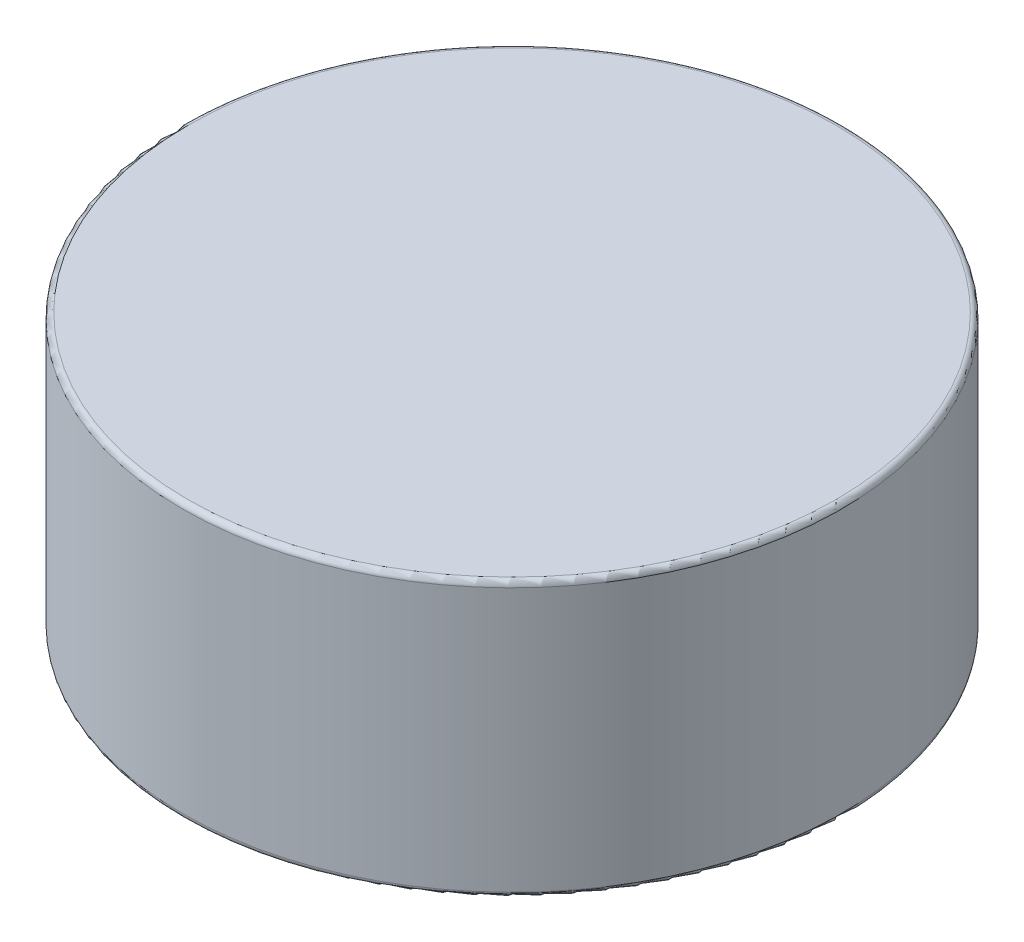
ISO-10303-21;
HEADER;
FILE_DESCRIPTION(('STEP AP214'),'2;1');
FILE_NAME('part.step','',(''),(''),'','','');
FILE_SCHEMA(('AUTOMOTIVE_DESIGN { 1 0 10303 214 1 1 1 1 }'));
ENDSEC;
DATA;
#1=APPLICATION_CONTEXT('core data for automotive mechanical design processes');
#2=APPLICATION_PROTOCOL_DEFINITION('international standard','automotive_design',2000,#1);
#3=PRODUCT_CONTEXT('',#1,'mechanical');
#4=PRODUCT('Part','Part','',(#3));
#5=PRODUCT_RELATED_PRODUCT_CATEGORY('part','',(#4));
#6=PRODUCT_DEFINITION_FORMATION('','',#4);
#7=PRODUCT_DEFINITION_CONTEXT('part definition',#1,'design');
#8=PRODUCT_DEFINITION('design','',#6,#7);
#9=PRODUCT_DEFINITION_SHAPE('','',#8);
#10=(LENGTH_UNIT() NAMED_UNIT(*) SI_UNIT(.MILLI.,.METRE.));
#11=(NAMED_UNIT(*) PLANE_ANGLE_UNIT() SI_UNIT($,.RADIAN.));
#12=(NAMED_UNIT(*) SI_UNIT($,.STERADIAN.) SOLID_ANGLE_UNIT());
#13=UNCERTAINTY_MEASURE_WITH_UNIT(LENGTH_MEASURE(1.E-05),#10,'distance_accuracy_value','');
#14=(GEOMETRIC_REPRESENTATION_CONTEXT(3) GLOBAL_UNCERTAINTY_ASSIGNED_CONTEXT((#13)) GLOBAL_UNIT_ASSIGNED_CONTEXT((#10,
#11,#12)) REPRESENTATION_CONTEXT('',''));
#15=CARTESIAN_POINT('',(0.,0.,0.));
#16=DIRECTION('',(0.,0.,1.));
#17=DIRECTION('',(1.,0.,0.));
#18=AXIS2_PLACEMENT_3D('',#15,#16,#17);
#19=CARTESIAN_POINT('',(0.,2.5,0.));
#20=DIRECTION('',(0.,-1.,0.));
#21=DIRECTION('',(0.,0.,-1.));
#22=AXIS2_PLACEMENT_3D('',#19,#20,#21);
#23=CYLINDRICAL_SURFACE('',#22,3.);
#24=CARTESIAN_POINT('',(0.,0.0500000000000001,0.));
#25=DIRECTION('',(0.,1.,0.));
#26=DIRECTION('',(0.,0.,1.));
#27=AXIS2_PLACEMENT_3D('',#24,#25,#26);
#28=CIRCLE('',#27,3.);
#29=CARTESIAN_POINT('',(0.,0.0500000000000001,3.));
#30=VERTEX_POINT('',#29);
#31=EDGE_CURVE('E40',#30,#30,#28,.T.);
#32=ORIENTED_EDGE('',*,*,#31,.T.);
#33=EDGE_LOOP('',(#32));
#34=FACE_BOUND('',#33,.T.);
#35=CARTESIAN_POINT('',(0.,2.45,0.));
#36=DIRECTION('',(0.,1.,0.));
#37=DIRECTION('',(0.,0.,1.));
#38=AXIS2_PLACEMENT_3D('',#35,#36,#37);
#39=CIRCLE('',#38,3.);
#40=CARTESIAN_POINT('',(0.,2.45,3.));
#41=VERTEX_POINT('',#40);
#42=EDGE_CURVE('E44',#41,#41,#39,.F.);
#43=ORIENTED_EDGE('',*,*,#42,.T.);
#44=EDGE_LOOP('',(#43));
#45=FACE_BOUND('',#44,.T.);
#46=ADVANCED_FACE('F33',(#34,#45),#23,.T.);
#47=CARTESIAN_POINT('',(0.,2.5,0.));
#48=DIRECTION('',(0.,1.,0.));
#49=DIRECTION('',(0.,0.,1.));
#50=AXIS2_PLACEMENT_3D('',#47,#48,#49);
#51=PLANE('',#50);
#52=CARTESIAN_POINT('',(0.,2.5,0.));
#53=DIRECTION('',(0.,1.,0.));
#54=DIRECTION('',(0.,0.,1.));
#55=AXIS2_PLACEMENT_3D('',#52,#53,#54);
#56=CIRCLE('',#55,2.95);
#57=CARTESIAN_POINT('',(0.,2.5,2.95));
#58=VERTEX_POINT('',#57);
#59=EDGE_CURVE('E48',#58,#58,#56,.T.);
#60=ORIENTED_EDGE('',*,*,#59,.T.);
#61=EDGE_LOOP('',(#60));
#62=FACE_BOUND('',#61,.T.);
#63=ADVANCED_FACE('F54',(#62),#51,.T.);
#64=CARTESIAN_POINT('',(0.,0.,0.));
#65=DIRECTION('',(0.,1.,0.));
#66=DIRECTION('',(0.,0.,1.));
#67=AXIS2_PLACEMENT_3D('',#64,#65,#66);
#68=PLANE('',#67);
#69=CARTESIAN_POINT('',(0.,0.,0.));
#70=DIRECTION('',(0.,1.,0.));
#71=DIRECTION('',(0.,0.,1.));
#72=AXIS2_PLACEMENT_3D('',#69,#70,#71);
#73=CIRCLE('',#72,2.95);
#74=CARTESIAN_POINT('',(0.,0.,2.95));
#75=VERTEX_POINT('',#74);
#76=EDGE_CURVE('E10',#75,#75,#73,.F.);
#77=ORIENTED_EDGE('',*,*,#76,.T.);
#78=EDGE_LOOP('',(#77));
#79=FACE_BOUND('',#78,.T.);
#80=ADVANCED_FACE('F58',(#79),#68,.F.);
#81=CARTESIAN_POINT('',(0.,2.45,0.));
#82=DIRECTION('',(0.,1.,0.));
#83=DIRECTION('',(0.,0.,1.));
#84=AXIS2_PLACEMENT_3D('',#81,#82,#83);
#85=TOROIDAL_SURFACE('',#84,2.95,0.05);
#86=ORIENTED_EDGE('',*,*,#42,.F.);
#87=EDGE_LOOP('',(#86));
#88=FACE_BOUND('',#87,.T.);
#89=ORIENTED_EDGE('',*,*,#59,.F.);
#90=EDGE_LOOP('',(#89));
#91=FACE_BOUND('',#90,.T.);
#92=ADVANCED_FACE('F56',(#88,#91),#85,.T.);
#93=CARTESIAN_POINT('',(0.,0.0500000000000001,0.));
#94=DIRECTION('',(0.,1.,0.));
#95=DIRECTION('',(0.,0.,1.));
#96=AXIS2_PLACEMENT_3D('',#93,#94,#95);
#97=TOROIDAL_SURFACE('',#96,2.95,0.05);
#98=ORIENTED_EDGE('',*,*,#76,.F.);
#99=EDGE_LOOP('',(#98));
#100=FACE_BOUND('',#99,.T.);
#101=ORIENTED_EDGE('',*,*,#31,.F.);
#102=EDGE_LOOP('',(#101));
#103=FACE_BOUND('',#102,.T.);
#104=ADVANCED_FACE('F35',(#100,#103),#97,.T.);
#105=CLOSED_SHELL('',(#46,#63,#80,#92,#104));
#106=MANIFOLD_SOLID_BREP('B2',#105);
#107=ADVANCED_BREP_SHAPE_REPRESENTATION('',(#18,#106),#14);
#108=SHAPE_DEFINITION_REPRESENTATION(#9,#107);
ENDSEC;
END-ISO-10303-21;
